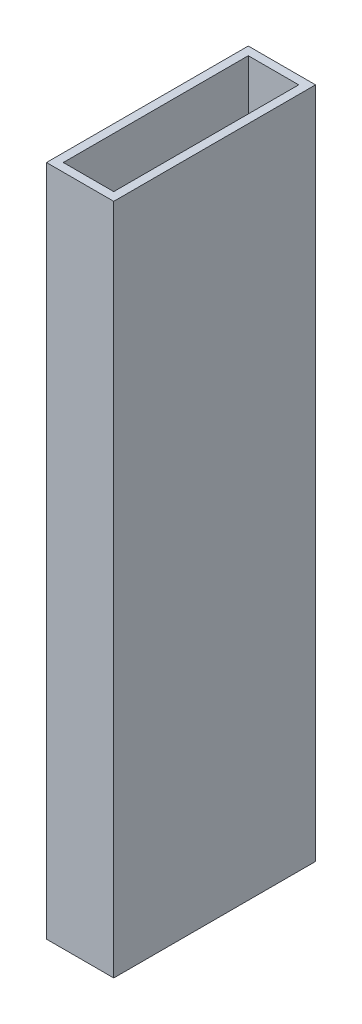
ISO-10303-21;
HEADER;
FILE_DESCRIPTION(('STEP AP214'),'2;1');
FILE_NAME('part.step','',(''),(''),'','','');
FILE_SCHEMA(('AUTOMOTIVE_DESIGN { 1 0 10303 214 1 1 1 1 }'));
ENDSEC;
DATA;
#1=APPLICATION_CONTEXT('core data for automotive mechanical design processes');
#2=APPLICATION_PROTOCOL_DEFINITION('international standard','automotive_design',2000,#1);
#3=PRODUCT_CONTEXT('',#1,'mechanical');
#4=PRODUCT('Part','Part','',(#3));
#5=PRODUCT_RELATED_PRODUCT_CATEGORY('part','',(#4));
#6=PRODUCT_DEFINITION_FORMATION('','',#4);
#7=PRODUCT_DEFINITION_CONTEXT('part definition',#1,'design');
#8=PRODUCT_DEFINITION('design','',#6,#7);
#9=PRODUCT_DEFINITION_SHAPE('','',#8);
#10=(LENGTH_UNIT() NAMED_UNIT(*) SI_UNIT(.MILLI.,.METRE.));
#11=(NAMED_UNIT(*) PLANE_ANGLE_UNIT() SI_UNIT($,.RADIAN.));
#12=(NAMED_UNIT(*) SI_UNIT($,.STERADIAN.) SOLID_ANGLE_UNIT());
#13=UNCERTAINTY_MEASURE_WITH_UNIT(LENGTH_MEASURE(1.E-05),#10,'distance_accuracy_value','');
#14=(GEOMETRIC_REPRESENTATION_CONTEXT(3) GLOBAL_UNCERTAINTY_ASSIGNED_CONTEXT((#13)) GLOBAL_UNIT_ASSIGNED_CONTEXT((#10,
#11,#12)) REPRESENTATION_CONTEXT('',''));
#15=CARTESIAN_POINT('',(0.,0.,0.));
#16=DIRECTION('',(0.,0.,1.));
#17=DIRECTION('',(1.,0.,0.));
#18=AXIS2_PLACEMENT_3D('',#15,#16,#17);
#19=CARTESIAN_POINT('',(0.,254.,0.));
#20=DIRECTION('',(-1.,0.,0.));
#21=DIRECTION('',(0.,0.,1.));
#22=AXIS2_PLACEMENT_3D('',#19,#20,#21);
#23=PLANE('',#22);
#24=DIRECTION('',(0.,0.,-1.));
#25=VECTOR('',#24,1.);
#26=CARTESIAN_POINT('',(0.,0.,0.));
#27=LINE('',#26,#25);
#28=CARTESIAN_POINT('',(0.,0.,0.));
#29=VERTEX_POINT('',#28);
#30=CARTESIAN_POINT('',(0.,0.,-76.2));
#31=VERTEX_POINT('',#30);
#32=EDGE_CURVE('E150',#29,#31,#27,.T.);
#33=ORIENTED_EDGE('',*,*,#32,.F.);
#34=DIRECTION('',(0.,-1.,0.));
#35=VECTOR('',#34,1.);
#36=CARTESIAN_POINT('',(0.,254.,0.));
#37=LINE('',#36,#35);
#38=CARTESIAN_POINT('',(0.,254.,0.));
#39=VERTEX_POINT('',#38);
#40=EDGE_CURVE('E11',#39,#29,#37,.T.);
#41=ORIENTED_EDGE('',*,*,#40,.F.);
#42=DIRECTION('',(0.,0.,-1.));
#43=VECTOR('',#42,1.);
#44=CARTESIAN_POINT('',(0.,254.,0.));
#45=LINE('',#44,#43);
#46=CARTESIAN_POINT('',(0.,254.,-76.2));
#47=VERTEX_POINT('',#46);
#48=EDGE_CURVE('E120',#39,#47,#45,.T.);
#49=ORIENTED_EDGE('',*,*,#48,.T.);
#50=DIRECTION('',(0.,-1.,0.));
#51=VECTOR('',#50,1.);
#52=CARTESIAN_POINT('',(0.,254.,-76.2));
#53=LINE('',#52,#51);
#54=EDGE_CURVE('E54',#47,#31,#53,.T.);
#55=ORIENTED_EDGE('',*,*,#54,.T.);
#56=EDGE_LOOP('',(#33,#41,#49,#55));
#57=FACE_BOUND('',#56,.T.);
#58=ADVANCED_FACE('F35',(#57),#23,.T.);
#59=CARTESIAN_POINT('',(0.,254.,0.));
#60=DIRECTION('',(0.,0.,-1.));
#61=DIRECTION('',(-1.,0.,0.));
#62=AXIS2_PLACEMENT_3D('',#59,#60,#61);
#63=PLANE('',#62);
#64=DIRECTION('',(1.,0.,0.));
#65=VECTOR('',#64,1.);
#66=CARTESIAN_POINT('',(0.,0.,0.));
#67=LINE('',#66,#65);
#68=CARTESIAN_POINT('',(25.4,0.,0.));
#69=VERTEX_POINT('',#68);
#70=EDGE_CURVE('E125',#29,#69,#67,.T.);
#71=ORIENTED_EDGE('',*,*,#70,.T.);
#72=DIRECTION('',(0.,-1.,0.));
#73=VECTOR('',#72,1.);
#74=CARTESIAN_POINT('',(25.4,254.,0.));
#75=LINE('',#74,#73);
#76=CARTESIAN_POINT('',(25.4,254.,0.));
#77=VERTEX_POINT('',#76);
#78=EDGE_CURVE('E45',#77,#69,#75,.T.);
#79=ORIENTED_EDGE('',*,*,#78,.F.);
#80=DIRECTION('',(1.,0.,0.));
#81=VECTOR('',#80,1.);
#82=CARTESIAN_POINT('',(0.,254.,0.));
#83=LINE('',#82,#81);
#84=EDGE_CURVE('E115',#39,#77,#83,.T.);
#85=ORIENTED_EDGE('',*,*,#84,.F.);
#86=ORIENTED_EDGE('',*,*,#40,.T.);
#87=EDGE_LOOP('',(#71,#79,#85,#86));
#88=FACE_BOUND('',#87,.T.);
#89=ADVANCED_FACE('F123',(#88),#63,.F.);
#90=CARTESIAN_POINT('',(25.4,254.,0.));
#91=DIRECTION('',(-1.,0.,0.));
#92=DIRECTION('',(0.,0.,1.));
#93=AXIS2_PLACEMENT_3D('',#90,#91,#92);
#94=PLANE('',#93);
#95=DIRECTION('',(0.,0.,-1.));
#96=VECTOR('',#95,1.);
#97=CARTESIAN_POINT('',(25.4,0.,0.));
#98=LINE('',#97,#96);
#99=CARTESIAN_POINT('',(25.4,0.,-76.2));
#100=VERTEX_POINT('',#99);
#101=EDGE_CURVE('E147',#69,#100,#98,.T.);
#102=ORIENTED_EDGE('',*,*,#101,.T.);
#103=DIRECTION('',(0.,-1.,0.));
#104=VECTOR('',#103,1.);
#105=CARTESIAN_POINT('',(25.4,254.,-76.2));
#106=LINE('',#105,#104);
#107=CARTESIAN_POINT('',(25.4,254.,-76.2));
#108=VERTEX_POINT('',#107);
#109=EDGE_CURVE('E80',#108,#100,#106,.T.);
#110=ORIENTED_EDGE('',*,*,#109,.F.);
#111=DIRECTION('',(0.,0.,-1.));
#112=VECTOR('',#111,1.);
#113=CARTESIAN_POINT('',(25.4,254.,0.));
#114=LINE('',#113,#112);
#115=EDGE_CURVE('E107',#77,#108,#114,.T.);
#116=ORIENTED_EDGE('',*,*,#115,.F.);
#117=ORIENTED_EDGE('',*,*,#78,.T.);
#118=EDGE_LOOP('',(#102,#110,#116,#117));
#119=FACE_BOUND('',#118,.T.);
#120=ADVANCED_FACE('F109',(#119),#94,.F.);
#121=CARTESIAN_POINT('',(22.225,254.,0.));
#122=DIRECTION('',(-1.,0.,0.));
#123=DIRECTION('',(0.,0.,1.));
#124=AXIS2_PLACEMENT_3D('',#121,#122,#123);
#125=PLANE('',#124);
#126=DIRECTION('',(0.,0.,-1.));
#127=VECTOR('',#126,1.);
#128=CARTESIAN_POINT('',(22.225,0.,0.));
#129=LINE('',#128,#127);
#130=CARTESIAN_POINT('',(22.225,0.,-3.175));
#131=VERTEX_POINT('',#130);
#132=CARTESIAN_POINT('',(22.225,0.,-73.025));
#133=VERTEX_POINT('',#132);
#134=EDGE_CURVE('E159',#131,#133,#129,.T.);
#135=ORIENTED_EDGE('',*,*,#134,.F.);
#136=DIRECTION('',(0.,-1.,0.));
#137=VECTOR('',#136,1.);
#138=CARTESIAN_POINT('',(22.225,254.,-3.175));
#139=LINE('',#138,#137);
#140=CARTESIAN_POINT('',(22.225,254.,-3.175));
#141=VERTEX_POINT('',#140);
#142=EDGE_CURVE('E39',#141,#131,#139,.T.);
#143=ORIENTED_EDGE('',*,*,#142,.F.);
#144=DIRECTION('',(0.,0.,-1.));
#145=VECTOR('',#144,1.);
#146=CARTESIAN_POINT('',(22.225,254.,0.));
#147=LINE('',#146,#145);
#148=CARTESIAN_POINT('',(22.225,254.,-73.025));
#149=VERTEX_POINT('',#148);
#150=EDGE_CURVE('E146',#141,#149,#147,.T.);
#151=ORIENTED_EDGE('',*,*,#150,.T.);
#152=DIRECTION('',(0.,-1.,0.));
#153=VECTOR('',#152,1.);
#154=CARTESIAN_POINT('',(22.225,254.,-73.025));
#155=LINE('',#154,#153);
#156=EDGE_CURVE('E130',#149,#133,#155,.T.);
#157=ORIENTED_EDGE('',*,*,#156,.T.);
#158=EDGE_LOOP('',(#135,#143,#151,#157));
#159=FACE_BOUND('',#158,.T.);
#160=ADVANCED_FACE('F37',(#159),#125,.T.);
#161=CARTESIAN_POINT('',(0.,254.,-3.175));
#162=DIRECTION('',(0.,0.,1.));
#163=DIRECTION('',(1.,0.,0.));
#164=AXIS2_PLACEMENT_3D('',#161,#162,#163);
#165=PLANE('',#164);
#166=DIRECTION('',(-1.,0.,0.));
#167=VECTOR('',#166,1.);
#168=CARTESIAN_POINT('',(0.,0.,-3.175));
#169=LINE('',#168,#167);
#170=CARTESIAN_POINT('',(3.175,0.,-3.175));
#171=VERTEX_POINT('',#170);
#172=EDGE_CURVE('E157',#131,#171,#169,.T.);
#173=ORIENTED_EDGE('',*,*,#172,.T.);
#174=DIRECTION('',(0.,-1.,0.));
#175=VECTOR('',#174,1.);
#176=CARTESIAN_POINT('',(3.175,254.,-3.175));
#177=LINE('',#176,#175);
#178=CARTESIAN_POINT('',(3.175,254.,-3.175));
#179=VERTEX_POINT('',#178);
#180=EDGE_CURVE('E134',#179,#171,#177,.T.);
#181=ORIENTED_EDGE('',*,*,#180,.F.);
#182=DIRECTION('',(-1.,0.,0.));
#183=VECTOR('',#182,1.);
#184=CARTESIAN_POINT('',(0.,254.,-3.175));
#185=LINE('',#184,#183);
#186=EDGE_CURVE('E168',#141,#179,#185,.T.);
#187=ORIENTED_EDGE('',*,*,#186,.F.);
#188=ORIENTED_EDGE('',*,*,#142,.T.);
#189=EDGE_LOOP('',(#173,#181,#187,#188));
#190=FACE_BOUND('',#189,.T.);
#191=ADVANCED_FACE('F181',(#190),#165,.F.);
#192=CARTESIAN_POINT('',(3.175,254.,0.));
#193=DIRECTION('',(-1.,0.,0.));
#194=DIRECTION('',(0.,0.,1.));
#195=AXIS2_PLACEMENT_3D('',#192,#193,#194);
#196=PLANE('',#195);
#197=DIRECTION('',(0.,0.,-1.));
#198=VECTOR('',#197,1.);
#199=CARTESIAN_POINT('',(3.175,0.,0.));
#200=LINE('',#199,#198);
#201=CARTESIAN_POINT('',(3.175,0.,-73.025));
#202=VERTEX_POINT('',#201);
#203=EDGE_CURVE('E155',#171,#202,#200,.T.);
#204=ORIENTED_EDGE('',*,*,#203,.T.);
#205=DIRECTION('',(0.,-1.,0.));
#206=VECTOR('',#205,1.);
#207=CARTESIAN_POINT('',(3.175,254.,-73.025));
#208=LINE('',#207,#206);
#209=CARTESIAN_POINT('',(3.175,254.,-73.025));
#210=VERTEX_POINT('',#209);
#211=EDGE_CURVE('E132',#210,#202,#208,.T.);
#212=ORIENTED_EDGE('',*,*,#211,.F.);
#213=DIRECTION('',(0.,0.,-1.));
#214=VECTOR('',#213,1.);
#215=CARTESIAN_POINT('',(3.175,254.,0.));
#216=LINE('',#215,#214);
#217=EDGE_CURVE('E166',#179,#210,#216,.T.);
#218=ORIENTED_EDGE('',*,*,#217,.F.);
#219=ORIENTED_EDGE('',*,*,#180,.T.);
#220=EDGE_LOOP('',(#204,#212,#218,#219));
#221=FACE_BOUND('',#220,.T.);
#222=ADVANCED_FACE('F182',(#221),#196,.F.);
#223=CARTESIAN_POINT('',(0.,254.,-73.025));
#224=DIRECTION('',(0.,0.,-1.));
#225=DIRECTION('',(-1.,0.,0.));
#226=AXIS2_PLACEMENT_3D('',#223,#224,#225);
#227=PLANE('',#226);
#228=DIRECTION('',(1.,0.,0.));
#229=VECTOR('',#228,1.);
#230=CARTESIAN_POINT('',(0.,0.,-73.025));
#231=LINE('',#230,#229);
#232=EDGE_CURVE('E152',#202,#133,#231,.T.);
#233=ORIENTED_EDGE('',*,*,#232,.T.);
#234=ORIENTED_EDGE('',*,*,#156,.F.);
#235=DIRECTION('',(1.,0.,0.));
#236=VECTOR('',#235,1.);
#237=CARTESIAN_POINT('',(0.,254.,-73.025));
#238=LINE('',#237,#236);
#239=EDGE_CURVE('E164',#210,#149,#238,.T.);
#240=ORIENTED_EDGE('',*,*,#239,.F.);
#241=ORIENTED_EDGE('',*,*,#211,.T.);
#242=EDGE_LOOP('',(#233,#234,#240,#241));
#243=FACE_BOUND('',#242,.T.);
#244=ADVANCED_FACE('F176',(#243),#227,.F.);
#245=CARTESIAN_POINT('',(0.,254.,-76.2));
#246=DIRECTION('',(0.,0.,-1.));
#247=DIRECTION('',(-1.,0.,0.));
#248=AXIS2_PLACEMENT_3D('',#245,#246,#247);
#249=PLANE('',#248);
#250=DIRECTION('',(1.,0.,0.));
#251=VECTOR('',#250,1.);
#252=CARTESIAN_POINT('',(0.,0.,-76.2));
#253=LINE('',#252,#251);
#254=EDGE_CURVE('E143',#31,#100,#253,.T.);
#255=ORIENTED_EDGE('',*,*,#254,.F.);
#256=ORIENTED_EDGE('',*,*,#54,.F.);
#257=DIRECTION('',(1.,0.,0.));
#258=VECTOR('',#257,1.);
#259=CARTESIAN_POINT('',(0.,254.,-76.2));
#260=LINE('',#259,#258);
#261=EDGE_CURVE('E114',#47,#108,#260,.T.);
#262=ORIENTED_EDGE('',*,*,#261,.T.);
#263=ORIENTED_EDGE('',*,*,#109,.T.);
#264=EDGE_LOOP('',(#255,#256,#262,#263));
#265=FACE_BOUND('',#264,.T.);
#266=ADVANCED_FACE('F189',(#265),#249,.T.);
#267=CARTESIAN_POINT('',(0.,254.,0.));
#268=DIRECTION('',(0.,1.,0.));
#269=DIRECTION('',(0.,0.,1.));
#270=AXIS2_PLACEMENT_3D('',#267,#268,#269);
#271=PLANE('',#270);
#272=ORIENTED_EDGE('',*,*,#150,.F.);
#273=ORIENTED_EDGE('',*,*,#186,.T.);
#274=ORIENTED_EDGE('',*,*,#217,.T.);
#275=ORIENTED_EDGE('',*,*,#239,.T.);
#276=EDGE_LOOP('',(#272,#273,#274,#275));
#277=FACE_BOUND('',#276,.T.);
#278=ORIENTED_EDGE('',*,*,#48,.F.);
#279=ORIENTED_EDGE('',*,*,#84,.T.);
#280=ORIENTED_EDGE('',*,*,#115,.T.);
#281=ORIENTED_EDGE('',*,*,#261,.F.);
#282=EDGE_LOOP('',(#278,#279,#280,#281));
#283=FACE_BOUND('',#282,.T.);
#284=ADVANCED_FACE('F119',(#277,#283),#271,.T.);
#285=CARTESIAN_POINT('',(0.,0.,0.));
#286=DIRECTION('',(0.,1.,0.));
#287=DIRECTION('',(0.,0.,1.));
#288=AXIS2_PLACEMENT_3D('',#285,#286,#287);
#289=PLANE('',#288);
#290=ORIENTED_EDGE('',*,*,#134,.T.);
#291=ORIENTED_EDGE('',*,*,#232,.F.);
#292=ORIENTED_EDGE('',*,*,#203,.F.);
#293=ORIENTED_EDGE('',*,*,#172,.F.);
#294=EDGE_LOOP('',(#290,#291,#292,#293));
#295=FACE_BOUND('',#294,.T.);
#296=ORIENTED_EDGE('',*,*,#32,.T.);
#297=ORIENTED_EDGE('',*,*,#254,.T.);
#298=ORIENTED_EDGE('',*,*,#101,.F.);
#299=ORIENTED_EDGE('',*,*,#70,.F.);
#300=EDGE_LOOP('',(#296,#297,#298,#299));
#301=FACE_BOUND('',#300,.T.);
#302=ADVANCED_FACE('F179',(#295,#301),#289,.F.);
#303=CLOSED_SHELL('',(#58,#89,#120,#160,#191,#222,#244,#266,#284,#302));
#304=MANIFOLD_SOLID_BREP('B2',#303);
#305=ADVANCED_BREP_SHAPE_REPRESENTATION('',(#18,#304),#14);
#306=SHAPE_DEFINITION_REPRESENTATION(#9,#305);
ENDSEC;
END-ISO-10303-21;
